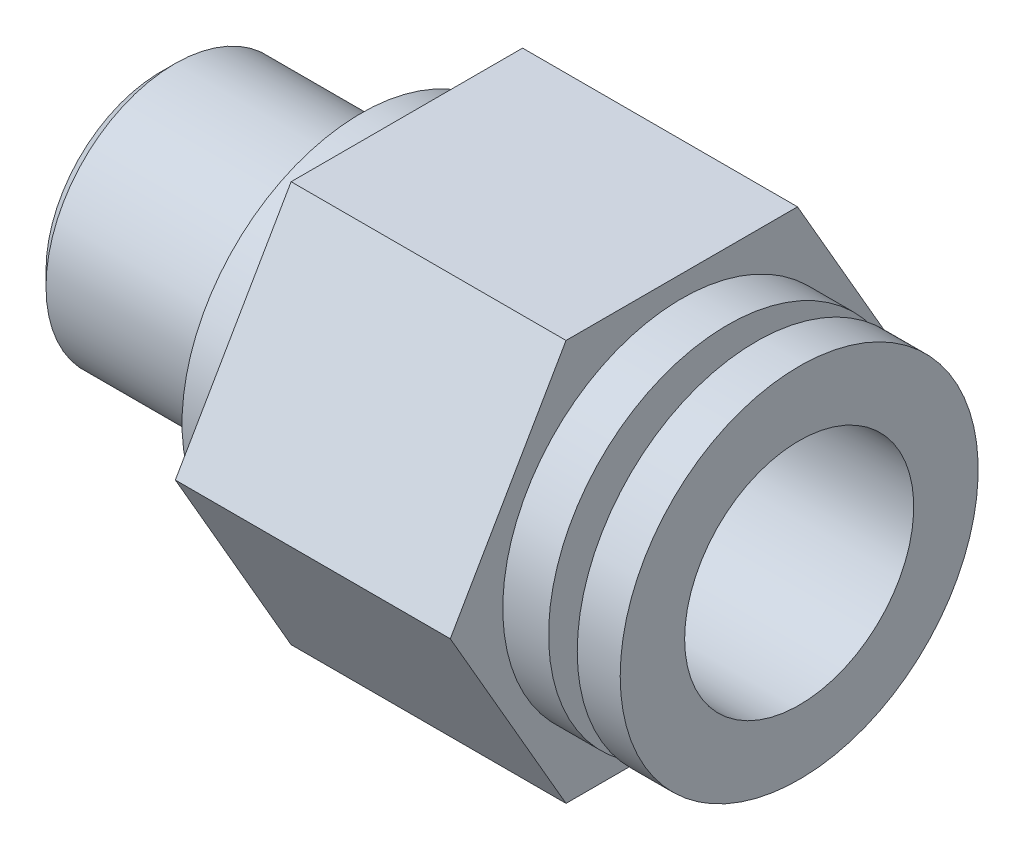
ISO-10303-21;
HEADER;
FILE_DESCRIPTION(('STEP AP214'),'2;1');
FILE_NAME('part.step','',(''),(''),'','','');
FILE_SCHEMA(('AUTOMOTIVE_DESIGN { 1 0 10303 214 1 1 1 1 }'));
ENDSEC;
DATA;
#1=APPLICATION_CONTEXT('core data for automotive mechanical design processes');
#2=APPLICATION_PROTOCOL_DEFINITION('international standard','automotive_design',2000,#1);
#3=PRODUCT_CONTEXT('',#1,'mechanical');
#4=PRODUCT('Part','Part','',(#3));
#5=PRODUCT_RELATED_PRODUCT_CATEGORY('part','',(#4));
#6=PRODUCT_DEFINITION_FORMATION('','',#4);
#7=PRODUCT_DEFINITION_CONTEXT('part definition',#1,'design');
#8=PRODUCT_DEFINITION('design','',#6,#7);
#9=PRODUCT_DEFINITION_SHAPE('','',#8);
#10=(LENGTH_UNIT() NAMED_UNIT(*) SI_UNIT(.MILLI.,.METRE.));
#11=(NAMED_UNIT(*) PLANE_ANGLE_UNIT() SI_UNIT($,.RADIAN.));
#12=(NAMED_UNIT(*) SI_UNIT($,.STERADIAN.) SOLID_ANGLE_UNIT());
#13=UNCERTAINTY_MEASURE_WITH_UNIT(LENGTH_MEASURE(1.E-05),#10,'distance_accuracy_value','');
#14=(GEOMETRIC_REPRESENTATION_CONTEXT(3) GLOBAL_UNCERTAINTY_ASSIGNED_CONTEXT((#13)) GLOBAL_UNIT_ASSIGNED_CONTEXT((#10,
#11,#12)) REPRESENTATION_CONTEXT('',''));
#15=CARTESIAN_POINT('',(0.,0.,0.));
#16=DIRECTION('',(0.,0.,1.));
#17=DIRECTION('',(1.,0.,0.));
#18=AXIS2_PLACEMENT_3D('',#15,#16,#17);
#19=CARTESIAN_POINT('',(0.,6.35,0.));
#20=DIRECTION('',(1.,0.,0.));
#21=DIRECTION('',(0.,0.,-1.));
#22=AXIS2_PLACEMENT_3D('',#19,#20,#21);
#23=PLANE('',#22);
#24=CARTESIAN_POINT('',(0.,0.,0.));
#25=DIRECTION('',(-1.,0.,0.));
#26=DIRECTION('',(0.,0.,1.));
#27=AXIS2_PLACEMENT_3D('',#24,#25,#26);
#28=CIRCLE('',#27,6.35);
#29=CARTESIAN_POINT('',(0.,0.,6.35));
#30=VERTEX_POINT('',#29);
#31=EDGE_CURVE('E72',#30,#30,#28,.T.);
#32=ORIENTED_EDGE('',*,*,#31,.F.);
#33=EDGE_LOOP('',(#32));
#34=FACE_BOUND('',#33,.T.);
#35=CARTESIAN_POINT('',(0.,0.,0.));
#36=DIRECTION('',(-1.,0.,0.));
#37=DIRECTION('',(0.,0.,1.));
#38=AXIS2_PLACEMENT_3D('',#35,#36,#37);
#39=CIRCLE('',#38,7.14375);
#40=CARTESIAN_POINT('',(0.,0.,7.14375));
#41=VERTEX_POINT('',#40);
#42=EDGE_CURVE('E11',#41,#41,#39,.T.);
#43=ORIENTED_EDGE('',*,*,#42,.T.);
#44=EDGE_LOOP('',(#43));
#45=FACE_BOUND('',#44,.T.);
#46=ADVANCED_FACE('F47',(#34,#45),#23,.F.);
#47=CARTESIAN_POINT('',(0.,0.,0.));
#48=DIRECTION('',(-1.,0.,0.));
#49=DIRECTION('',(0.,0.,1.));
#50=AXIS2_PLACEMENT_3D('',#47,#48,#49);
#51=CYLINDRICAL_SURFACE('',#50,7.14375);
#52=ORIENTED_EDGE('',*,*,#42,.F.);
#53=EDGE_LOOP('',(#52));
#54=FACE_BOUND('',#53,.T.);
#55=CARTESIAN_POINT('',(11.7475,0.,0.));
#56=DIRECTION('',(-1.,0.,0.));
#57=DIRECTION('',(0.,0.,1.));
#58=AXIS2_PLACEMENT_3D('',#55,#56,#57);
#59=CIRCLE('',#58,7.14375);
#60=CARTESIAN_POINT('',(11.7475,0.,7.14375));
#61=VERTEX_POINT('',#60);
#62=EDGE_CURVE('E54',#61,#61,#59,.T.);
#63=ORIENTED_EDGE('',*,*,#62,.T.);
#64=EDGE_LOOP('',(#63));
#65=FACE_BOUND('',#64,.T.);
#66=ADVANCED_FACE('F81',(#54,#65),#51,.T.);
#67=CARTESIAN_POINT('',(11.7475,7.14375,0.));
#68=DIRECTION('',(1.,0.,0.));
#69=DIRECTION('',(0.,0.,-1.));
#70=AXIS2_PLACEMENT_3D('',#67,#68,#69);
#71=PLANE('',#70);
#72=ORIENTED_EDGE('',*,*,#62,.F.);
#73=EDGE_LOOP('',(#72));
#74=FACE_BOUND('',#73,.T.);
#75=CARTESIAN_POINT('',(11.7475,0.,0.));
#76=DIRECTION('',(-1.,0.,0.));
#77=DIRECTION('',(0.,0.,1.));
#78=AXIS2_PLACEMENT_3D('',#75,#76,#77);
#79=CIRCLE('',#78,9.921875);
#80=CARTESIAN_POINT('',(11.7475,0.,9.921875));
#81=VERTEX_POINT('',#80);
#82=EDGE_CURVE('E60',#81,#81,#79,.T.);
#83=ORIENTED_EDGE('',*,*,#82,.T.);
#84=EDGE_LOOP('',(#83));
#85=FACE_BOUND('',#84,.T.);
#86=ADVANCED_FACE('F85',(#74,#85),#71,.F.);
#87=CARTESIAN_POINT('',(0.,0.,0.));
#88=DIRECTION('',(-1.,0.,0.));
#89=DIRECTION('',(0.,0.,1.));
#90=AXIS2_PLACEMENT_3D('',#87,#88,#89);
#91=CYLINDRICAL_SURFACE('',#90,9.921875);
#92=ORIENTED_EDGE('',*,*,#82,.F.);
#93=EDGE_LOOP('',(#92));
#94=FACE_BOUND('',#93,.T.);
#95=CARTESIAN_POINT('',(14.12875,0.,0.));
#96=DIRECTION('',(-1.,0.,0.));
#97=DIRECTION('',(0.,0.,1.));
#98=AXIS2_PLACEMENT_3D('',#95,#96,#97);
#99=CIRCLE('',#98,9.921875);
#100=CARTESIAN_POINT('',(14.12875,0.,9.921875));
#101=VERTEX_POINT('',#100);
#102=EDGE_CURVE('E64',#101,#101,#99,.T.);
#103=ORIENTED_EDGE('',*,*,#102,.T.);
#104=EDGE_LOOP('',(#103));
#105=FACE_BOUND('',#104,.T.);
#106=ADVANCED_FACE('F90',(#94,#105),#91,.T.);
#107=CARTESIAN_POINT('',(14.12875,9.921875,0.));
#108=DIRECTION('',(-1.,0.,0.));
#109=DIRECTION('',(0.,0.,1.));
#110=AXIS2_PLACEMENT_3D('',#107,#108,#109);
#111=PLANE('',#110);
#112=ORIENTED_EDGE('',*,*,#102,.F.);
#113=EDGE_LOOP('',(#112));
#114=FACE_BOUND('',#113,.T.);
#115=CARTESIAN_POINT('',(14.12875,0.,0.));
#116=DIRECTION('',(-1.,0.,0.));
#117=DIRECTION('',(0.,0.,1.));
#118=AXIS2_PLACEMENT_3D('',#115,#116,#117);
#119=CIRCLE('',#118,6.35);
#120=CARTESIAN_POINT('',(14.12875,0.,6.35));
#121=VERTEX_POINT('',#120);
#122=EDGE_CURVE('E69',#121,#121,#119,.T.);
#123=ORIENTED_EDGE('',*,*,#122,.T.);
#124=EDGE_LOOP('',(#123));
#125=FACE_BOUND('',#124,.T.);
#126=ADVANCED_FACE('F96',(#114,#125),#111,.F.);
#127=CARTESIAN_POINT('',(0.,0.,0.));
#128=DIRECTION('',(-1.,0.,0.));
#129=DIRECTION('',(0.,0.,1.));
#130=AXIS2_PLACEMENT_3D('',#127,#128,#129);
#131=CYLINDRICAL_SURFACE('',#130,6.35);
#132=ORIENTED_EDGE('',*,*,#122,.F.);
#133=EDGE_LOOP('',(#132));
#134=FACE_BOUND('',#133,.T.);
#135=ORIENTED_EDGE('',*,*,#31,.T.);
#136=EDGE_LOOP('',(#135));
#137=FACE_BOUND('',#136,.T.);
#138=ADVANCED_FACE('F78',(#134,#137),#131,.F.);
#139=CLOSED_SHELL('',(#46,#66,#86,#106,#126,#138));
#140=MANIFOLD_SOLID_BREP('B2',#139);
#141=CARTESIAN_POINT('',(10.16,0.,0.));
#142=DIRECTION('',(1.,0.,0.));
#143=DIRECTION('',(0.,0.,-1.));
#144=AXIS2_PLACEMENT_3D('',#141,#142,#143);
#145=PLANE('',#144);
#146=CARTESIAN_POINT('',(10.16,0.,0.));
#147=DIRECTION('',(1.,0.,0.));
#148=DIRECTION('',(0.,0.,-1.));
#149=AXIS2_PLACEMENT_3D('',#146,#147,#148);
#150=CIRCLE('',#149,9.921875);
#151=CARTESIAN_POINT('',(10.16,0.,-9.921875));
#152=VERTEX_POINT('',#151);
#153=EDGE_CURVE('E260',#152,#152,#150,.T.);
#154=ORIENTED_EDGE('',*,*,#153,.T.);
#155=EDGE_LOOP('',(#154));
#156=FACE_BOUND('',#155,.T.);
#157=CARTESIAN_POINT('',(10.16,0.,0.));
#158=DIRECTION('',(1.,0.,0.));
#159=DIRECTION('',(0.,0.,-1.));
#160=AXIS2_PLACEMENT_3D('',#157,#158,#159);
#161=CIRCLE('',#160,7.14375);
#162=CARTESIAN_POINT('',(10.16,0.,7.14375));
#163=VERTEX_POINT('',#162);
#164=EDGE_CURVE('E370',#163,#163,#161,.T.);
#165=ORIENTED_EDGE('',*,*,#164,.F.);
#166=EDGE_LOOP('',(#165));
#167=FACE_BOUND('',#166,.T.);
#168=ADVANCED_FACE('F147',(#156,#167),#145,.T.);
#169=CARTESIAN_POINT('',(-10.16,0.,0.));
#170=DIRECTION('',(1.,0.,0.));
#171=DIRECTION('',(0.,0.,-1.));
#172=AXIS2_PLACEMENT_3D('',#169,#170,#171);
#173=PLANE('',#172);
#174=CARTESIAN_POINT('',(-10.16,0.,0.));
#175=DIRECTION('',(1.,0.,0.));
#176=DIRECTION('',(0.,0.,-1.));
#177=AXIS2_PLACEMENT_3D('',#174,#175,#176);
#178=CIRCLE('',#177,9.921875);
#179=CARTESIAN_POINT('',(-10.16,0.,-9.921875));
#180=VERTEX_POINT('',#179);
#181=EDGE_CURVE('E264',#180,#180,#178,.T.);
#182=ORIENTED_EDGE('',*,*,#181,.F.);
#183=EDGE_LOOP('',(#182));
#184=FACE_BOUND('',#183,.T.);
#185=CARTESIAN_POINT('',(-10.16,0.,0.));
#186=DIRECTION('',(1.,0.,0.));
#187=DIRECTION('',(0.,0.,-1.));
#188=AXIS2_PLACEMENT_3D('',#185,#186,#187);
#189=CIRCLE('',#188,7.14375);
#190=CARTESIAN_POINT('',(-10.16,0.,-7.14375));
#191=VERTEX_POINT('',#190);
#192=EDGE_CURVE('E271',#191,#191,#189,.F.);
#193=ORIENTED_EDGE('',*,*,#192,.F.);
#194=EDGE_LOOP('',(#193));
#195=FACE_BOUND('',#194,.T.);
#196=ADVANCED_FACE('F300',(#184,#195),#173,.F.);
#197=CARTESIAN_POINT('',(10.16,0.,0.));
#198=DIRECTION('',(-1.,0.,0.));
#199=DIRECTION('',(0.,0.,1.));
#200=AXIS2_PLACEMENT_3D('',#197,#198,#199);
#201=CYLINDRICAL_SURFACE('',#200,9.921875);
#202=CARTESIAN_POINT('',(7.62,0.,0.));
#203=DIRECTION('',(1.,0.,0.));
#204=DIRECTION('',(0.,0.,-1.));
#205=AXIS2_PLACEMENT_3D('',#202,#203,#204);
#206=CIRCLE('',#205,9.921875);
#207=CARTESIAN_POINT('',(7.62,0.,-9.921875));
#208=VERTEX_POINT('',#207);
#209=EDGE_CURVE('E259',#208,#208,#206,.T.);
#210=ORIENTED_EDGE('',*,*,#209,.T.);
#211=EDGE_LOOP('',(#210));
#212=FACE_BOUND('',#211,.T.);
#213=ORIENTED_EDGE('',*,*,#153,.F.);
#214=EDGE_LOOP('',(#213));
#215=FACE_BOUND('',#214,.T.);
#216=ADVANCED_FACE('F306',(#212,#215),#201,.T.);
#217=CARTESIAN_POINT('',(7.62,11.1125,-19.2474145991091));
#218=DIRECTION('',(1.,0.,0.));
#219=DIRECTION('',(0.,0.,-1.));
#220=AXIS2_PLACEMENT_3D('',#217,#218,#219);
#221=PLANE('',#220);
#222=DIRECTION('',(0.,0.866025403784439,-0.5));
#223=VECTOR('',#222,1.);
#224=CARTESIAN_POINT('',(7.62,-11.1125,-6.41580486636972));
#225=LINE('',#224,#223);
#226=CARTESIAN_POINT('',(7.62,-11.1125,-6.41580486636972));
#227=VERTEX_POINT('',#226);
#228=CARTESIAN_POINT('',(7.62,0.,-12.8316097327394));
#229=VERTEX_POINT('',#228);
#230=EDGE_CURVE('E248',#227,#229,#225,.T.);
#231=ORIENTED_EDGE('',*,*,#230,.T.);
#232=DIRECTION('',(0.,0.866025403784439,0.5));
#233=VECTOR('',#232,1.);
#234=CARTESIAN_POINT('',(7.62,0.,-12.8316097327394));
#235=LINE('',#234,#233);
#236=CARTESIAN_POINT('',(7.62,11.1125,-6.41580486636971));
#237=VERTEX_POINT('',#236);
#238=EDGE_CURVE('E203',#229,#237,#235,.T.);
#239=ORIENTED_EDGE('',*,*,#238,.T.);
#240=DIRECTION('',(0.,0.,1.));
#241=VECTOR('',#240,1.);
#242=CARTESIAN_POINT('',(7.62,11.1125,-6.41580486636971));
#243=LINE('',#242,#241);
#244=CARTESIAN_POINT('',(7.62,11.1125,6.41580486636972));
#245=VERTEX_POINT('',#244);
#246=EDGE_CURVE('E217',#237,#245,#243,.T.);
#247=ORIENTED_EDGE('',*,*,#246,.T.);
#248=DIRECTION('',(0.,-0.866025403784439,0.5));
#249=VECTOR('',#248,1.);
#250=CARTESIAN_POINT('',(7.62,11.1125,6.41580486636972));
#251=LINE('',#250,#249);
#252=CARTESIAN_POINT('',(7.62,0.,12.8316097327394));
#253=VERTEX_POINT('',#252);
#254=EDGE_CURVE('E210',#245,#253,#251,.T.);
#255=ORIENTED_EDGE('',*,*,#254,.T.);
#256=DIRECTION('',(0.,-0.866025403784439,-0.5));
#257=VECTOR('',#256,1.);
#258=CARTESIAN_POINT('',(7.62,0.,12.8316097327394));
#259=LINE('',#258,#257);
#260=CARTESIAN_POINT('',(7.62,-11.1125,6.41580486636972));
#261=VERTEX_POINT('',#260);
#262=EDGE_CURVE('E215',#253,#261,#259,.T.);
#263=ORIENTED_EDGE('',*,*,#262,.T.);
#264=DIRECTION('',(0.,0.,-1.));
#265=VECTOR('',#264,1.);
#266=CARTESIAN_POINT('',(7.62,-11.1125,6.41580486636972));
#267=LINE('',#266,#265);
#268=EDGE_CURVE('E165',#261,#227,#267,.T.);
#269=ORIENTED_EDGE('',*,*,#268,.T.);
#270=EDGE_LOOP('',(#231,#239,#247,#255,#263,#269));
#271=FACE_BOUND('',#270,.T.);
#272=ORIENTED_EDGE('',*,*,#209,.F.);
#273=EDGE_LOOP('',(#272));
#274=FACE_BOUND('',#273,.T.);
#275=ADVANCED_FACE('F212',(#271,#274),#221,.T.);
#276=CARTESIAN_POINT('',(-7.62,11.1125,-19.2474145991091));
#277=DIRECTION('',(1.,0.,0.));
#278=DIRECTION('',(0.,0.,-1.));
#279=AXIS2_PLACEMENT_3D('',#276,#277,#278);
#280=PLANE('',#279);
#281=DIRECTION('',(0.,0.866025403784439,-0.5));
#282=VECTOR('',#281,1.);
#283=CARTESIAN_POINT('',(-7.62,-11.1125,-6.41580486636972));
#284=LINE('',#283,#282);
#285=CARTESIAN_POINT('',(-7.62,-11.1125,-6.41580486636972));
#286=VERTEX_POINT('',#285);
#287=CARTESIAN_POINT('',(-7.62,0.,-12.8316097327394));
#288=VERTEX_POINT('',#287);
#289=EDGE_CURVE('E236',#286,#288,#284,.T.);
#290=ORIENTED_EDGE('',*,*,#289,.F.);
#291=DIRECTION('',(0.,0.,-1.));
#292=VECTOR('',#291,1.);
#293=CARTESIAN_POINT('',(-7.62,-11.1125,6.41580486636972));
#294=LINE('',#293,#292);
#295=CARTESIAN_POINT('',(-7.62,-11.1125,6.41580486636972));
#296=VERTEX_POINT('',#295);
#297=EDGE_CURVE('E194',#296,#286,#294,.T.);
#298=ORIENTED_EDGE('',*,*,#297,.F.);
#299=DIRECTION('',(0.,-0.866025403784439,-0.5));
#300=VECTOR('',#299,1.);
#301=CARTESIAN_POINT('',(-7.62,0.,12.8316097327394));
#302=LINE('',#301,#300);
#303=CARTESIAN_POINT('',(-7.62,0.,12.8316097327394));
#304=VERTEX_POINT('',#303);
#305=EDGE_CURVE('E188',#304,#296,#302,.T.);
#306=ORIENTED_EDGE('',*,*,#305,.F.);
#307=DIRECTION('',(0.,-0.866025403784439,0.5));
#308=VECTOR('',#307,1.);
#309=CARTESIAN_POINT('',(-7.62,11.1125,6.41580486636972));
#310=LINE('',#309,#308);
#311=CARTESIAN_POINT('',(-7.62,11.1125,6.41580486636972));
#312=VERTEX_POINT('',#311);
#313=EDGE_CURVE('E225',#312,#304,#310,.T.);
#314=ORIENTED_EDGE('',*,*,#313,.F.);
#315=DIRECTION('',(0.,0.,1.));
#316=VECTOR('',#315,1.);
#317=CARTESIAN_POINT('',(-7.62,11.1125,-6.41580486636971));
#318=LINE('',#317,#316);
#319=CARTESIAN_POINT('',(-7.62,11.1125,-6.41580486636971));
#320=VERTEX_POINT('',#319);
#321=EDGE_CURVE('E242',#320,#312,#318,.T.);
#322=ORIENTED_EDGE('',*,*,#321,.F.);
#323=DIRECTION('',(0.,0.866025403784439,0.5));
#324=VECTOR('',#323,1.);
#325=CARTESIAN_POINT('',(-7.62,0.,-12.8316097327394));
#326=LINE('',#325,#324);
#327=EDGE_CURVE('E239',#288,#320,#326,.T.);
#328=ORIENTED_EDGE('',*,*,#327,.F.);
#329=EDGE_LOOP('',(#290,#298,#306,#314,#322,#328));
#330=FACE_BOUND('',#329,.T.);
#331=CARTESIAN_POINT('',(-7.62,0.,0.));
#332=DIRECTION('',(1.,0.,0.));
#333=DIRECTION('',(0.,0.,-1.));
#334=AXIS2_PLACEMENT_3D('',#331,#332,#333);
#335=CIRCLE('',#334,9.921875);
#336=CARTESIAN_POINT('',(-7.62,0.,-9.921875));
#337=VERTEX_POINT('',#336);
#338=EDGE_CURVE('E263',#337,#337,#335,.T.);
#339=ORIENTED_EDGE('',*,*,#338,.T.);
#340=EDGE_LOOP('',(#339));
#341=FACE_BOUND('',#340,.T.);
#342=ADVANCED_FACE('F319',(#330,#341),#280,.F.);
#343=CARTESIAN_POINT('',(7.62,-11.1125,-6.41580486636972));
#344=DIRECTION('',(0.,0.5,0.866025403784439));
#345=DIRECTION('',(0.,-0.866025403784439,0.5));
#346=AXIS2_PLACEMENT_3D('',#343,#344,#345);
#347=PLANE('',#346);
#348=ORIENTED_EDGE('',*,*,#289,.T.);
#349=DIRECTION('',(-1.,0.,0.));
#350=VECTOR('',#349,1.);
#351=CARTESIAN_POINT('',(7.62,0.,-12.8316097327394));
#352=LINE('',#351,#350);
#353=EDGE_CURVE('E256',#229,#288,#352,.T.);
#354=ORIENTED_EDGE('',*,*,#353,.F.);
#355=ORIENTED_EDGE('',*,*,#230,.F.);
#356=DIRECTION('',(-1.,0.,0.));
#357=VECTOR('',#356,1.);
#358=CARTESIAN_POINT('',(7.62,-11.1125,-6.41580486636972));
#359=LINE('',#358,#357);
#360=EDGE_CURVE('E232',#227,#286,#359,.T.);
#361=ORIENTED_EDGE('',*,*,#360,.T.);
#362=EDGE_LOOP('',(#348,#354,#355,#361));
#363=FACE_BOUND('',#362,.T.);
#364=ADVANCED_FACE('F311',(#363),#347,.F.);
#365=CARTESIAN_POINT('',(7.62,0.,-12.8316097327394));
#366=DIRECTION('',(0.,-0.5,0.866025403784439));
#367=DIRECTION('',(0.,-0.866025403784439,-0.5));
#368=AXIS2_PLACEMENT_3D('',#365,#366,#367);
#369=PLANE('',#368);
#370=ORIENTED_EDGE('',*,*,#327,.T.);
#371=DIRECTION('',(-1.,0.,0.));
#372=VECTOR('',#371,1.);
#373=CARTESIAN_POINT('',(7.62,11.1125,-6.41580486636971));
#374=LINE('',#373,#372);
#375=EDGE_CURVE('E252',#237,#320,#374,.T.);
#376=ORIENTED_EDGE('',*,*,#375,.F.);
#377=ORIENTED_EDGE('',*,*,#238,.F.);
#378=ORIENTED_EDGE('',*,*,#353,.T.);
#379=EDGE_LOOP('',(#370,#376,#377,#378));
#380=FACE_BOUND('',#379,.T.);
#381=ADVANCED_FACE('F342',(#380),#369,.F.);
#382=CARTESIAN_POINT('',(7.62,11.1125,-6.41580486636971));
#383=DIRECTION('',(0.,-1.,0.));
#384=DIRECTION('',(0.,0.,-1.));
#385=AXIS2_PLACEMENT_3D('',#382,#383,#384);
#386=PLANE('',#385);
#387=ORIENTED_EDGE('',*,*,#321,.T.);
#388=DIRECTION('',(-1.,0.,0.));
#389=VECTOR('',#388,1.);
#390=CARTESIAN_POINT('',(7.62,11.1125,6.41580486636972));
#391=LINE('',#390,#389);
#392=EDGE_CURVE('E227',#245,#312,#391,.T.);
#393=ORIENTED_EDGE('',*,*,#392,.F.);
#394=ORIENTED_EDGE('',*,*,#246,.F.);
#395=ORIENTED_EDGE('',*,*,#375,.T.);
#396=EDGE_LOOP('',(#387,#393,#394,#395));
#397=FACE_BOUND('',#396,.T.);
#398=ADVANCED_FACE('F350',(#397),#386,.F.);
#399=CARTESIAN_POINT('',(7.62,11.1125,6.41580486636972));
#400=DIRECTION('',(0.,-0.5,-0.866025403784439));
#401=DIRECTION('',(0.,0.866025403784439,-0.5));
#402=AXIS2_PLACEMENT_3D('',#399,#400,#401);
#403=PLANE('',#402);
#404=ORIENTED_EDGE('',*,*,#313,.T.);
#405=DIRECTION('',(-1.,0.,0.));
#406=VECTOR('',#405,1.);
#407=CARTESIAN_POINT('',(7.62,0.,12.8316097327394));
#408=LINE('',#407,#406);
#409=EDGE_CURVE('E222',#253,#304,#408,.T.);
#410=ORIENTED_EDGE('',*,*,#409,.F.);
#411=ORIENTED_EDGE('',*,*,#254,.F.);
#412=ORIENTED_EDGE('',*,*,#392,.T.);
#413=EDGE_LOOP('',(#404,#410,#411,#412));
#414=FACE_BOUND('',#413,.T.);
#415=ADVANCED_FACE('F223',(#414),#403,.F.);
#416=CARTESIAN_POINT('',(7.62,0.,12.8316097327394));
#417=DIRECTION('',(0.,0.5,-0.866025403784438));
#418=DIRECTION('',(0.,0.866025403784439,0.5));
#419=AXIS2_PLACEMENT_3D('',#416,#417,#418);
#420=PLANE('',#419);
#421=ORIENTED_EDGE('',*,*,#305,.T.);
#422=DIRECTION('',(-1.,0.,0.));
#423=VECTOR('',#422,1.);
#424=CARTESIAN_POINT('',(7.62,-11.1125,6.41580486636972));
#425=LINE('',#424,#423);
#426=EDGE_CURVE('E228',#261,#296,#425,.T.);
#427=ORIENTED_EDGE('',*,*,#426,.F.);
#428=ORIENTED_EDGE('',*,*,#262,.F.);
#429=ORIENTED_EDGE('',*,*,#409,.T.);
#430=EDGE_LOOP('',(#421,#427,#428,#429));
#431=FACE_BOUND('',#430,.T.);
#432=ADVANCED_FACE('F230',(#431),#420,.F.);
#433=CARTESIAN_POINT('',(7.62,-11.1125,6.41580486636972));
#434=DIRECTION('',(0.,1.,0.));
#435=DIRECTION('',(0.,0.,1.));
#436=AXIS2_PLACEMENT_3D('',#433,#434,#435);
#437=PLANE('',#436);
#438=ORIENTED_EDGE('',*,*,#297,.T.);
#439=ORIENTED_EDGE('',*,*,#360,.F.);
#440=ORIENTED_EDGE('',*,*,#268,.F.);
#441=ORIENTED_EDGE('',*,*,#426,.T.);
#442=EDGE_LOOP('',(#438,#439,#440,#441));
#443=FACE_BOUND('',#442,.T.);
#444=ADVANCED_FACE('F323',(#443),#437,.F.);
#445=ORIENTED_EDGE('',*,*,#181,.T.);
#446=EDGE_LOOP('',(#445));
#447=FACE_BOUND('',#446,.T.);
#448=ORIENTED_EDGE('',*,*,#338,.F.);
#449=EDGE_LOOP('',(#448));
#450=FACE_BOUND('',#449,.T.);
#451=ADVANCED_FACE('F315',(#447,#450),#201,.T.);
#452=CARTESIAN_POINT('',(-21.2725,0.,0.));
#453=DIRECTION('',(1.,0.,0.));
#454=DIRECTION('',(0.,0.,-1.));
#455=AXIS2_PLACEMENT_3D('',#452,#453,#454);
#456=CYLINDRICAL_SURFACE('',#455,7.14375);
#457=CARTESIAN_POINT('',(-20.47875,0.,0.));
#458=DIRECTION('',(-1.,0.,0.));
#459=DIRECTION('',(0.,0.,1.));
#460=AXIS2_PLACEMENT_3D('',#457,#458,#459);
#461=CIRCLE('',#460,7.14375);
#462=CARTESIAN_POINT('',(-20.47875,0.,7.14375));
#463=VERTEX_POINT('',#462);
#464=EDGE_CURVE('E45',#463,#463,#461,.F.);
#465=ORIENTED_EDGE('',*,*,#464,.T.);
#466=EDGE_LOOP('',(#465));
#467=FACE_BOUND('',#466,.T.);
#468=ORIENTED_EDGE('',*,*,#192,.T.);
#469=EDGE_LOOP('',(#468));
#470=FACE_BOUND('',#469,.T.);
#471=ADVANCED_FACE('F295',(#467,#470),#456,.T.);
#472=CARTESIAN_POINT('',(-21.2725,0.,0.));
#473=DIRECTION('',(-1.,0.,0.));
#474=DIRECTION('',(0.,0.,1.));
#475=AXIS2_PLACEMENT_3D('',#472,#473,#474);
#476=PLANE('',#475);
#477=CARTESIAN_POINT('',(-21.2725,0.,0.));
#478=DIRECTION('',(1.,0.,0.));
#479=DIRECTION('',(0.,0.,-1.));
#480=AXIS2_PLACEMENT_3D('',#477,#478,#479);
#481=CIRCLE('',#480,3.571875);
#482=CARTESIAN_POINT('',(-21.2725,0.,-3.571875));
#483=VERTEX_POINT('',#482);
#484=EDGE_CURVE('E240',#483,#483,#481,.T.);
#485=ORIENTED_EDGE('',*,*,#484,.T.);
#486=EDGE_LOOP('',(#485));
#487=FACE_BOUND('',#486,.T.);
#488=CARTESIAN_POINT('',(-21.2725,0.,0.));
#489=DIRECTION('',(-1.,0.,0.));
#490=DIRECTION('',(0.,0.,1.));
#491=AXIS2_PLACEMENT_3D('',#488,#489,#490);
#492=CIRCLE('',#491,6.34999999999999);
#493=CARTESIAN_POINT('',(-21.2725,0.,6.34999999999999));
#494=VERTEX_POINT('',#493);
#495=EDGE_CURVE('E157',#494,#494,#492,.T.);
#496=ORIENTED_EDGE('',*,*,#495,.T.);
#497=EDGE_LOOP('',(#496));
#498=FACE_BOUND('',#497,.T.);
#499=ADVANCED_FACE('F283',(#487,#498),#476,.T.);
#500=CARTESIAN_POINT('',(-21.2725,0.,0.));
#501=DIRECTION('',(1.,0.,0.));
#502=DIRECTION('',(0.,0.,-1.));
#503=AXIS2_PLACEMENT_3D('',#500,#501,#502);
#504=CONICAL_SURFACE('',#503,6.34999999999999,0.785398163397448);
#505=ORIENTED_EDGE('',*,*,#464,.F.);
#506=EDGE_LOOP('',(#505));
#507=FACE_BOUND('',#506,.T.);
#508=ORIENTED_EDGE('',*,*,#495,.F.);
#509=EDGE_LOOP('',(#508));
#510=FACE_BOUND('',#509,.T.);
#511=ADVANCED_FACE('F149',(#507,#510),#504,.T.);
#512=CARTESIAN_POINT('',(-21.2725,0.,0.));
#513=DIRECTION('',(1.,0.,0.));
#514=DIRECTION('',(0.,0.,-1.));
#515=AXIS2_PLACEMENT_3D('',#512,#513,#514);
#516=CYLINDRICAL_SURFACE('',#515,3.571875);
#517=ORIENTED_EDGE('',*,*,#484,.F.);
#518=EDGE_LOOP('',(#517));
#519=FACE_BOUND('',#518,.T.);
#520=CARTESIAN_POINT('',(0.,0.,0.));
#521=DIRECTION('',(1.,0.,0.));
#522=DIRECTION('',(0.,0.,-1.));
#523=AXIS2_PLACEMENT_3D('',#520,#521,#522);
#524=CIRCLE('',#523,3.571875);
#525=CARTESIAN_POINT('',(0.,0.,-3.571875));
#526=VERTEX_POINT('',#525);
#527=EDGE_CURVE('E366',#526,#526,#524,.F.);
#528=ORIENTED_EDGE('',*,*,#527,.F.);
#529=EDGE_LOOP('',(#528));
#530=FACE_BOUND('',#529,.T.);
#531=ADVANCED_FACE('F286',(#519,#530),#516,.F.);
#532=CARTESIAN_POINT('',(0.,0.,0.));
#533=DIRECTION('',(1.,0.,0.));
#534=DIRECTION('',(0.,0.,-1.));
#535=AXIS2_PLACEMENT_3D('',#532,#533,#534);
#536=PLANE('',#535);
#537=CARTESIAN_POINT('',(0.,0.,0.));
#538=DIRECTION('',(1.,0.,0.));
#539=DIRECTION('',(0.,0.,-1.));
#540=AXIS2_PLACEMENT_3D('',#537,#538,#539);
#541=CIRCLE('',#540,7.14375);
#542=CARTESIAN_POINT('',(0.,0.,7.14375));
#543=VERTEX_POINT('',#542);
#544=EDGE_CURVE('E373',#543,#543,#541,.T.);
#545=ORIENTED_EDGE('',*,*,#544,.T.);
#546=EDGE_LOOP('',(#545));
#547=FACE_BOUND('',#546,.T.);
#548=ORIENTED_EDGE('',*,*,#527,.T.);
#549=EDGE_LOOP('',(#548));
#550=FACE_BOUND('',#549,.T.);
#551=ADVANCED_FACE('F292',(#547,#550),#536,.T.);
#552=CARTESIAN_POINT('',(10.161,0.,0.));
#553=DIRECTION('',(-1.,0.,0.));
#554=DIRECTION('',(0.,0.,1.));
#555=AXIS2_PLACEMENT_3D('',#552,#553,#554);
#556=CYLINDRICAL_SURFACE('',#555,7.14375);
#557=CARTESIAN_POINT('',(10.16,0.,7.14375));
#558=CARTESIAN_POINT('',(10.0541666666667,0.,7.14375));
#559=CARTESIAN_POINT('',(9.94833333333333,0.,7.14375));
#560=CARTESIAN_POINT('',(9.73666666666667,0.,7.14375));
#561=CARTESIAN_POINT('',(9.63083333333333,0.,7.14375));
#562=CARTESIAN_POINT('',(9.41916666666667,0.,7.14375));
#563=CARTESIAN_POINT('',(9.31333333333333,0.,7.14375));
#564=CARTESIAN_POINT('',(9.10166666666667,0.,7.14375));
#565=CARTESIAN_POINT('',(8.99583333333333,0.,7.14375));
#566=CARTESIAN_POINT('',(8.78416666666667,0.,7.14375));
#567=CARTESIAN_POINT('',(8.67833333333333,0.,7.14375));
#568=CARTESIAN_POINT('',(8.46666666666667,0.,7.14375));
#569=CARTESIAN_POINT('',(8.36083333333333,0.,7.14375));
#570=CARTESIAN_POINT('',(8.14916666666667,0.,7.14375));
#571=CARTESIAN_POINT('',(8.04333333333333,0.,7.14375));
#572=CARTESIAN_POINT('',(7.83166666666667,0.,7.14375));
#573=CARTESIAN_POINT('',(7.72583333333333,0.,7.14375));
#574=CARTESIAN_POINT('',(7.51416666666667,0.,7.14375));
#575=CARTESIAN_POINT('',(7.40833333333333,0.,7.14375));
#576=CARTESIAN_POINT('',(7.19666666666667,0.,7.14375));
#577=CARTESIAN_POINT('',(7.09083333333333,0.,7.14375));
#578=CARTESIAN_POINT('',(6.87916666666667,0.,7.14375));
#579=CARTESIAN_POINT('',(6.77333333333333,0.,7.14375));
#580=CARTESIAN_POINT('',(6.56166666666667,0.,7.14375));
#581=CARTESIAN_POINT('',(6.45583333333333,0.,7.14375));
#582=CARTESIAN_POINT('',(6.24416666666667,0.,7.14375));
#583=CARTESIAN_POINT('',(6.13833333333333,0.,7.14375));
#584=CARTESIAN_POINT('',(5.92666666666667,0.,7.14375));
#585=CARTESIAN_POINT('',(5.82083333333333,0.,7.14375));
#586=CARTESIAN_POINT('',(5.60916666666667,0.,7.14375));
#587=CARTESIAN_POINT('',(5.50333333333333,0.,7.14375));
#588=CARTESIAN_POINT('',(5.29166666666667,0.,7.14375));
#589=CARTESIAN_POINT('',(5.18583333333333,0.,7.14375));
#590=CARTESIAN_POINT('',(4.97416666666667,0.,7.14375));
#591=CARTESIAN_POINT('',(4.86833333333333,0.,7.14375));
#592=CARTESIAN_POINT('',(4.65666666666667,0.,7.14375));
#593=CARTESIAN_POINT('',(4.55083333333333,0.,7.14375));
#594=CARTESIAN_POINT('',(4.33916666666667,0.,7.14375));
#595=CARTESIAN_POINT('',(4.23333333333333,0.,7.14375));
#596=CARTESIAN_POINT('',(4.02166666666667,0.,7.14375));
#597=CARTESIAN_POINT('',(3.91583333333333,0.,7.14375));
#598=CARTESIAN_POINT('',(3.70416666666667,0.,7.14375));
#599=CARTESIAN_POINT('',(3.59833333333333,0.,7.14375));
#600=CARTESIAN_POINT('',(3.38666666666667,0.,7.14375));
#601=CARTESIAN_POINT('',(3.28083333333333,0.,7.14375));
#602=CARTESIAN_POINT('',(3.06916666666667,0.,7.14375));
#603=CARTESIAN_POINT('',(2.96333333333333,0.,7.14375));
#604=CARTESIAN_POINT('',(2.75166666666667,0.,7.14375));
#605=CARTESIAN_POINT('',(2.64583333333333,0.,7.14375));
#606=CARTESIAN_POINT('',(2.43416666666667,0.,7.14375));
#607=CARTESIAN_POINT('',(2.32833333333333,0.,7.14375));
#608=CARTESIAN_POINT('',(2.11666666666667,0.,7.14375));
#609=CARTESIAN_POINT('',(2.01083333333333,0.,7.14375));
#610=CARTESIAN_POINT('',(1.79916666666667,0.,7.14375));
#611=CARTESIAN_POINT('',(1.69333333333333,0.,7.14375));
#612=CARTESIAN_POINT('',(1.48166666666667,0.,7.14375));
#613=CARTESIAN_POINT('',(1.37583333333333,0.,7.14375));
#614=CARTESIAN_POINT('',(1.16416666666667,0.,7.14375));
#615=CARTESIAN_POINT('',(1.05833333333333,0.,7.14375));
#616=CARTESIAN_POINT('',(0.846666666666666,0.,7.14375));
#617=CARTESIAN_POINT('',(0.740833333333332,0.,7.14375));
#618=CARTESIAN_POINT('',(0.529166666666666,0.,7.14375));
#619=CARTESIAN_POINT('',(0.423333333333333,0.,7.14375));
#620=CARTESIAN_POINT('',(0.211666666666666,0.,7.14375));
#621=CARTESIAN_POINT('',(0.105833333333332,0.,7.14375));
#622=CARTESIAN_POINT('',(0.,0.,7.14375));
#623=B_SPLINE_CURVE_WITH_KNOTS('',3,(#557,#558,#559,#560,#561,#562,#563,#564,#565,#566,#567,
#568,#569,#570,#571,#572,#573,#574,#575,#576,#577,#578,#579,#580,#581,#582,#583,#584,#585,#586,
#587,#588,#589,#590,#591,#592,#593,#594,#595,#596,#597,#598,#599,#600,#601,#602,#603,#604,#605,
#606,#607,#608,#609,#610,#611,#612,#613,#614,#615,#616,#617,#618,#619,#620,#621,#622),
.UNSPECIFIED.,.F.,.F.,(4,2,2,2,2,2,2,2,2,2,2,2,2,2,2,2,2,2,2,2,2,2,2,2,2,2,2,2,2,2,2,2,4),(0.,
0.3175,0.635,0.9525,1.27,1.5875,1.905,2.2225,2.54,2.8575,3.175,3.4925,3.81,4.1275,4.445,4.7625,
5.08,5.3975,5.715,6.0325,6.35,6.6675,6.985,7.3025,7.62,7.9375,8.255,8.5725,8.89,9.2075,9.525,
9.8425,10.16),.UNSPECIFIED.);
#624=EDGE_CURVE('BSEAM381',#163,#543,#623,.T.);
#625=ORIENTED_EDGE('',*,*,#164,.T.);
#626=ORIENTED_EDGE('',*,*,#544,.F.);
#627=ORIENTED_EDGE('',*,*,#624,.T.);
#628=ORIENTED_EDGE('',*,*,#624,.F.);
#629=EDGE_LOOP('',(#625,#627,#626,#628));
#630=FACE_BOUND('',#629,.T.);
#631=ADVANCED_FACE('F381',(#630),#556,.F.);
#632=CLOSED_SHELL('',(#168,#196,#216,#275,#342,#364,#381,#398,#415,#432,#444,#451,#471,#499,
#511,#531,#551,#631));
#633=MANIFOLD_SOLID_BREP('B6',#632);
#634=ADVANCED_BREP_SHAPE_REPRESENTATION('',(#18,#140,#633),#14);
#635=SHAPE_DEFINITION_REPRESENTATION(#9,#634);
ENDSEC;
END-ISO-10303-21;
